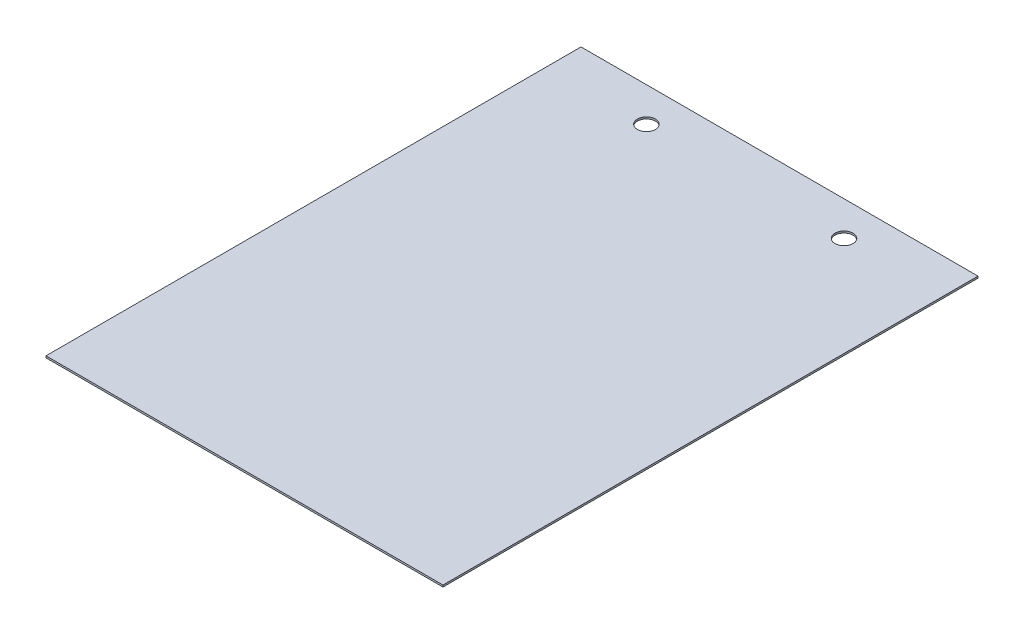
ISO-10303-21;
HEADER;
FILE_DESCRIPTION(('STEP AP214'),'2;1');
FILE_NAME('part.step','',(''),(''),'','','');
FILE_SCHEMA(('AUTOMOTIVE_DESIGN { 1 0 10303 214 1 1 1 1 }'));
ENDSEC;
DATA;
#1=APPLICATION_CONTEXT('core data for automotive mechanical design processes');
#2=APPLICATION_PROTOCOL_DEFINITION('international standard','automotive_design',2000,#1);
#3=PRODUCT_CONTEXT('',#1,'mechanical');
#4=PRODUCT('Part','Part','',(#3));
#5=PRODUCT_RELATED_PRODUCT_CATEGORY('part','',(#4));
#6=PRODUCT_DEFINITION_FORMATION('','',#4);
#7=PRODUCT_DEFINITION_CONTEXT('part definition',#1,'design');
#8=PRODUCT_DEFINITION('design','',#6,#7);
#9=PRODUCT_DEFINITION_SHAPE('','',#8);
#10=(LENGTH_UNIT() NAMED_UNIT(*) SI_UNIT(.MILLI.,.METRE.));
#11=(NAMED_UNIT(*) PLANE_ANGLE_UNIT() SI_UNIT($,.RADIAN.));
#12=(NAMED_UNIT(*) SI_UNIT($,.STERADIAN.) SOLID_ANGLE_UNIT());
#13=UNCERTAINTY_MEASURE_WITH_UNIT(LENGTH_MEASURE(1.E-05),#10,'distance_accuracy_value','');
#14=(GEOMETRIC_REPRESENTATION_CONTEXT(3) GLOBAL_UNCERTAINTY_ASSIGNED_CONTEXT((#13)) GLOBAL_UNIT_ASSIGNED_CONTEXT((#10,
#11,#12)) REPRESENTATION_CONTEXT('',''));
#15=CARTESIAN_POINT('',(0.,0.,0.));
#16=DIRECTION('',(0.,0.,1.));
#17=DIRECTION('',(1.,0.,0.));
#18=AXIS2_PLACEMENT_3D('',#15,#16,#17);
#19=CARTESIAN_POINT('',(-1021.,-928.25,840.45));
#20=DIRECTION('',(0.,-1.,0.));
#21=DIRECTION('',(0.,0.,-1.));
#22=AXIS2_PLACEMENT_3D('',#19,#20,#21);
#23=PLANE('',#22);
#24=DIRECTION('',(1.,0.,0.));
#25=VECTOR('',#24,1.);
#26=CARTESIAN_POINT('',(-1241.,-928.25,840.45));
#27=LINE('',#26,#25);
#28=CARTESIAN_POINT('',(-1241.,-928.25,840.45));
#29=VERTEX_POINT('',#28);
#30=CARTESIAN_POINT('',(-801.,-928.25,840.45));
#31=VERTEX_POINT('',#30);
#32=EDGE_CURVE('E115',#29,#31,#27,.T.);
#33=ORIENTED_EDGE('',*,*,#32,.F.);
#34=DIRECTION('',(0.,0.,-1.));
#35=VECTOR('',#34,1.);
#36=CARTESIAN_POINT('',(-1241.,-928.25,1433.45));
#37=LINE('',#36,#35);
#38=CARTESIAN_POINT('',(-1241.,-928.25,1433.45));
#39=VERTEX_POINT('',#38);
#40=EDGE_CURVE('E36',#39,#29,#37,.T.);
#41=ORIENTED_EDGE('',*,*,#40,.F.);
#42=DIRECTION('',(-1.,0.,0.));
#43=VECTOR('',#42,1.);
#44=CARTESIAN_POINT('',(-801.,-928.25,1433.45));
#45=LINE('',#44,#43);
#46=CARTESIAN_POINT('',(-801.,-928.25,1433.45));
#47=VERTEX_POINT('',#46);
#48=EDGE_CURVE('E183',#47,#39,#45,.T.);
#49=ORIENTED_EDGE('',*,*,#48,.F.);
#50=DIRECTION('',(0.,0.,1.));
#51=VECTOR('',#50,1.);
#52=CARTESIAN_POINT('',(-801.,-928.25,840.45));
#53=LINE('',#52,#51);
#54=EDGE_CURVE('E242',#31,#47,#53,.T.);
#55=ORIENTED_EDGE('',*,*,#54,.F.);
#56=EDGE_LOOP('',(#33,#41,#49,#55));
#57=FACE_BOUND('',#56,.T.);
#58=CARTESIAN_POINT('',(-911.5,-928.25,878.45));
#59=DIRECTION('',(0.,-1.,0.));
#60=DIRECTION('',(-1.,0.,0.));
#61=AXIS2_PLACEMENT_3D('',#58,#59,#60);
#62=CIRCLE('',#61,10.);
#63=CARTESIAN_POINT('',(-921.5,-928.25,878.45));
#64=VERTEX_POINT('',#63);
#65=CARTESIAN_POINT('',(-901.5,-928.25,878.45));
#66=VERTEX_POINT('',#65);
#67=EDGE_CURVE('E11',#64,#66,#62,.T.);
#68=ORIENTED_EDGE('',*,*,#67,.T.);
#69=CARTESIAN_POINT('',(-911.5,-928.25,878.45));
#70=DIRECTION('',(0.,-1.,0.));
#71=DIRECTION('',(1.,0.,0.));
#72=AXIS2_PLACEMENT_3D('',#69,#70,#71);
#73=CIRCLE('',#72,10.);
#74=EDGE_CURVE('E27',#66,#64,#73,.T.);
#75=ORIENTED_EDGE('',*,*,#74,.T.);
#76=EDGE_LOOP('',(#68,#75));
#77=FACE_BOUND('',#76,.T.);
#78=CARTESIAN_POINT('',(-1130.5,-928.25,878.45));
#79=DIRECTION('',(0.,-1.,0.));
#80=DIRECTION('',(-1.,0.,0.));
#81=AXIS2_PLACEMENT_3D('',#78,#79,#80);
#82=CIRCLE('',#81,10.);
#83=CARTESIAN_POINT('',(-1140.5,-928.25,878.45));
#84=VERTEX_POINT('',#83);
#85=CARTESIAN_POINT('',(-1120.5,-928.25,878.45));
#86=VERTEX_POINT('',#85);
#87=EDGE_CURVE('E170',#84,#86,#82,.T.);
#88=ORIENTED_EDGE('',*,*,#87,.T.);
#89=CARTESIAN_POINT('',(-1130.5,-928.25,878.45));
#90=DIRECTION('',(0.,-1.,0.));
#91=DIRECTION('',(1.,0.,0.));
#92=AXIS2_PLACEMENT_3D('',#89,#90,#91);
#93=CIRCLE('',#92,10.);
#94=EDGE_CURVE('E173',#86,#84,#93,.T.);
#95=ORIENTED_EDGE('',*,*,#94,.T.);
#96=EDGE_LOOP('',(#88,#95));
#97=FACE_BOUND('',#96,.T.);
#98=ADVANCED_FACE('F17',(#57,#77,#97),#23,.F.);
#99=CARTESIAN_POINT('',(-801.,-928.25,840.45));
#100=DIRECTION('',(1.,0.,0.));
#101=DIRECTION('',(0.,1.,0.));
#102=AXIS2_PLACEMENT_3D('',#99,#100,#101);
#103=PLANE('',#102);
#104=ORIENTED_EDGE('',*,*,#54,.T.);
#105=DIRECTION('',(0.,1.,0.));
#106=VECTOR('',#105,1.);
#107=CARTESIAN_POINT('',(-801.,-930.27,1433.45));
#108=LINE('',#107,#106);
#109=CARTESIAN_POINT('',(-801.,-930.27,1433.45));
#110=VERTEX_POINT('',#109);
#111=EDGE_CURVE('E189',#110,#47,#108,.T.);
#112=ORIENTED_EDGE('',*,*,#111,.F.);
#113=DIRECTION('',(0.,0.,-1.));
#114=VECTOR('',#113,1.);
#115=CARTESIAN_POINT('',(-801.,-930.27,1433.45));
#116=LINE('',#115,#114);
#117=CARTESIAN_POINT('',(-801.,-930.27,840.45));
#118=VERTEX_POINT('',#117);
#119=EDGE_CURVE('E245',#110,#118,#116,.T.);
#120=ORIENTED_EDGE('',*,*,#119,.T.);
#121=DIRECTION('',(0.,-1.,0.));
#122=VECTOR('',#121,1.);
#123=CARTESIAN_POINT('',(-801.,-928.25,840.45));
#124=LINE('',#123,#122);
#125=EDGE_CURVE('E251',#31,#118,#124,.T.);
#126=ORIENTED_EDGE('',*,*,#125,.F.);
#127=EDGE_LOOP('',(#104,#112,#120,#126));
#128=FACE_BOUND('',#127,.T.);
#129=ADVANCED_FACE('F282',(#128),#103,.T.);
#130=CARTESIAN_POINT('',(-1241.,-928.25,840.45));
#131=DIRECTION('',(0.,0.,-1.));
#132=DIRECTION('',(0.,-1.,0.));
#133=AXIS2_PLACEMENT_3D('',#130,#131,#132);
#134=PLANE('',#133);
#135=ORIENTED_EDGE('',*,*,#32,.T.);
#136=ORIENTED_EDGE('',*,*,#125,.T.);
#137=DIRECTION('',(-1.,0.,0.));
#138=VECTOR('',#137,1.);
#139=CARTESIAN_POINT('',(-801.,-930.27,840.45));
#140=LINE('',#139,#138);
#141=CARTESIAN_POINT('',(-1241.,-930.27,840.45));
#142=VERTEX_POINT('',#141);
#143=EDGE_CURVE('E218',#118,#142,#140,.T.);
#144=ORIENTED_EDGE('',*,*,#143,.T.);
#145=DIRECTION('',(0.,1.,0.));
#146=VECTOR('',#145,1.);
#147=CARTESIAN_POINT('',(-1241.,-930.27,840.45));
#148=LINE('',#147,#146);
#149=EDGE_CURVE('E216',#142,#29,#148,.T.);
#150=ORIENTED_EDGE('',*,*,#149,.T.);
#151=EDGE_LOOP('',(#135,#136,#144,#150));
#152=FACE_BOUND('',#151,.T.);
#153=ADVANCED_FACE('F273',(#152),#134,.T.);
#154=CARTESIAN_POINT('',(-1241.,-928.25,1433.45));
#155=DIRECTION('',(-1.,0.,0.));
#156=DIRECTION('',(0.,0.,1.));
#157=AXIS2_PLACEMENT_3D('',#154,#155,#156);
#158=PLANE('',#157);
#159=ORIENTED_EDGE('',*,*,#40,.T.);
#160=ORIENTED_EDGE('',*,*,#149,.F.);
#161=DIRECTION('',(0.,0.,1.));
#162=VECTOR('',#161,1.);
#163=CARTESIAN_POINT('',(-1241.,-930.27,840.45));
#164=LINE('',#163,#162);
#165=CARTESIAN_POINT('',(-1241.,-930.27,1433.45));
#166=VERTEX_POINT('',#165);
#167=EDGE_CURVE('E207',#142,#166,#164,.T.);
#168=ORIENTED_EDGE('',*,*,#167,.T.);
#169=DIRECTION('',(0.,1.,0.));
#170=VECTOR('',#169,1.);
#171=CARTESIAN_POINT('',(-1241.,-930.27,1433.45));
#172=LINE('',#171,#170);
#173=EDGE_CURVE('E185',#166,#39,#172,.T.);
#174=ORIENTED_EDGE('',*,*,#173,.T.);
#175=EDGE_LOOP('',(#159,#160,#168,#174));
#176=FACE_BOUND('',#175,.T.);
#177=ADVANCED_FACE('F19',(#176),#158,.T.);
#178=CARTESIAN_POINT('',(-801.,-928.25,1433.45));
#179=DIRECTION('',(0.,0.,1.));
#180=DIRECTION('',(-1.,0.,0.));
#181=AXIS2_PLACEMENT_3D('',#178,#179,#180);
#182=PLANE('',#181);
#183=ORIENTED_EDGE('',*,*,#48,.T.);
#184=ORIENTED_EDGE('',*,*,#173,.F.);
#185=DIRECTION('',(1.,0.,0.));
#186=VECTOR('',#185,1.);
#187=CARTESIAN_POINT('',(-1241.,-930.27,1433.45));
#188=LINE('',#187,#186);
#189=EDGE_CURVE('E186',#166,#110,#188,.T.);
#190=ORIENTED_EDGE('',*,*,#189,.T.);
#191=ORIENTED_EDGE('',*,*,#111,.T.);
#192=EDGE_LOOP('',(#183,#184,#190,#191));
#193=FACE_BOUND('',#192,.T.);
#194=ADVANCED_FACE('F279',(#193),#182,.T.);
#195=CARTESIAN_POINT('',(-1021.,-930.27,840.45));
#196=DIRECTION('',(0.,1.,0.));
#197=DIRECTION('',(-1.,0.,0.));
#198=AXIS2_PLACEMENT_3D('',#195,#196,#197);
#199=PLANE('',#198);
#200=ORIENTED_EDGE('',*,*,#119,.F.);
#201=ORIENTED_EDGE('',*,*,#189,.F.);
#202=ORIENTED_EDGE('',*,*,#167,.F.);
#203=ORIENTED_EDGE('',*,*,#143,.F.);
#204=EDGE_LOOP('',(#200,#201,#202,#203));
#205=FACE_BOUND('',#204,.T.);
#206=CARTESIAN_POINT('',(-876.,-930.27,1378.45));
#207=DIRECTION('',(0.,-1.,0.));
#208=DIRECTION('',(1.,0.,0.));
#209=AXIS2_PLACEMENT_3D('',#206,#207,#208);
#210=CIRCLE('',#209,25.);
#211=CARTESIAN_POINT('',(-851.,-930.27,1378.45));
#212=VERTEX_POINT('',#211);
#213=CARTESIAN_POINT('',(-876.,-930.27,1403.45));
#214=VERTEX_POINT('',#213);
#215=EDGE_CURVE('E149',#212,#214,#210,.T.);
#216=ORIENTED_EDGE('',*,*,#215,.F.);
#217=DIRECTION('',(0.,0.,-1.));
#218=VECTOR('',#217,1.);
#219=CARTESIAN_POINT('',(-851.,-930.27,1378.45));
#220=LINE('',#219,#218);
#221=CARTESIAN_POINT('',(-851.,-930.27,943.45));
#222=VERTEX_POINT('',#221);
#223=EDGE_CURVE('E187',#212,#222,#220,.T.);
#224=ORIENTED_EDGE('',*,*,#223,.T.);
#225=CARTESIAN_POINT('',(-876.,-930.27,943.45));
#226=DIRECTION('',(0.,-1.,0.));
#227=DIRECTION('',(0.,0.,-1.));
#228=AXIS2_PLACEMENT_3D('',#225,#226,#227);
#229=CIRCLE('',#228,25.);
#230=CARTESIAN_POINT('',(-876.,-930.27,918.45));
#231=VERTEX_POINT('',#230);
#232=EDGE_CURVE('E128',#231,#222,#229,.T.);
#233=ORIENTED_EDGE('',*,*,#232,.F.);
#234=DIRECTION('',(-1.,0.,0.));
#235=VECTOR('',#234,1.);
#236=CARTESIAN_POINT('',(-876.,-930.27,918.45));
#237=LINE('',#236,#235);
#238=CARTESIAN_POINT('',(-1166.,-930.27,918.45));
#239=VERTEX_POINT('',#238);
#240=EDGE_CURVE('E177',#231,#239,#237,.T.);
#241=ORIENTED_EDGE('',*,*,#240,.T.);
#242=CARTESIAN_POINT('',(-1166.,-930.27,943.45));
#243=DIRECTION('',(0.,1.,0.));
#244=DIRECTION('',(0.,0.,-1.));
#245=AXIS2_PLACEMENT_3D('',#242,#243,#244);
#246=CIRCLE('',#245,25.);
#247=CARTESIAN_POINT('',(-1191.,-930.27,943.45));
#248=VERTEX_POINT('',#247);
#249=EDGE_CURVE('E223',#239,#248,#246,.T.);
#250=ORIENTED_EDGE('',*,*,#249,.T.);
#251=DIRECTION('',(0.,0.,1.));
#252=VECTOR('',#251,1.);
#253=CARTESIAN_POINT('',(-1191.,-930.27,943.45));
#254=LINE('',#253,#252);
#255=CARTESIAN_POINT('',(-1191.,-930.27,1378.45));
#256=VERTEX_POINT('',#255);
#257=EDGE_CURVE('E226',#248,#256,#254,.T.);
#258=ORIENTED_EDGE('',*,*,#257,.T.);
#259=CARTESIAN_POINT('',(-1166.,-930.27,1378.45));
#260=DIRECTION('',(0.,1.,0.));
#261=DIRECTION('',(-1.,0.,0.));
#262=AXIS2_PLACEMENT_3D('',#259,#260,#261);
#263=CIRCLE('',#262,25.);
#264=CARTESIAN_POINT('',(-1166.,-930.27,1403.45));
#265=VERTEX_POINT('',#264);
#266=EDGE_CURVE('E227',#256,#265,#263,.T.);
#267=ORIENTED_EDGE('',*,*,#266,.T.);
#268=DIRECTION('',(1.,0.,0.));
#269=VECTOR('',#268,1.);
#270=CARTESIAN_POINT('',(-1166.,-930.27,1403.45));
#271=LINE('',#270,#269);
#272=EDGE_CURVE('E229',#265,#214,#271,.T.);
#273=ORIENTED_EDGE('',*,*,#272,.T.);
#274=EDGE_LOOP('',(#216,#224,#233,#241,#250,#258,#267,#273));
#275=FACE_BOUND('',#274,.T.);
#276=CARTESIAN_POINT('',(-911.5,-930.27,878.45));
#277=DIRECTION('',(0.,-1.,0.));
#278=DIRECTION('',(-1.,0.,0.));
#279=AXIS2_PLACEMENT_3D('',#276,#277,#278);
#280=CIRCLE('',#279,10.);
#281=CARTESIAN_POINT('',(-921.5,-930.27,878.45));
#282=VERTEX_POINT('',#281);
#283=CARTESIAN_POINT('',(-901.5,-930.27,878.45));
#284=VERTEX_POINT('',#283);
#285=EDGE_CURVE('E154',#282,#284,#280,.T.);
#286=ORIENTED_EDGE('',*,*,#285,.F.);
#287=CARTESIAN_POINT('',(-911.5,-930.27,878.45));
#288=DIRECTION('',(0.,-1.,0.));
#289=DIRECTION('',(1.,0.,0.));
#290=AXIS2_PLACEMENT_3D('',#287,#288,#289);
#291=CIRCLE('',#290,10.);
#292=EDGE_CURVE('E158',#284,#282,#291,.T.);
#293=ORIENTED_EDGE('',*,*,#292,.F.);
#294=EDGE_LOOP('',(#286,#293));
#295=FACE_BOUND('',#294,.T.);
#296=CARTESIAN_POINT('',(-1130.5,-930.27,878.45));
#297=DIRECTION('',(0.,-1.,0.));
#298=DIRECTION('',(-1.,0.,0.));
#299=AXIS2_PLACEMENT_3D('',#296,#297,#298);
#300=CIRCLE('',#299,10.);
#301=CARTESIAN_POINT('',(-1140.5,-930.27,878.45));
#302=VERTEX_POINT('',#301);
#303=CARTESIAN_POINT('',(-1120.5,-930.27,878.45));
#304=VERTEX_POINT('',#303);
#305=EDGE_CURVE('E215',#302,#304,#300,.T.);
#306=ORIENTED_EDGE('',*,*,#305,.F.);
#307=CARTESIAN_POINT('',(-1130.5,-930.27,878.45));
#308=DIRECTION('',(0.,-1.,0.));
#309=DIRECTION('',(1.,0.,0.));
#310=AXIS2_PLACEMENT_3D('',#307,#308,#309);
#311=CIRCLE('',#310,10.);
#312=EDGE_CURVE('E179',#304,#302,#311,.T.);
#313=ORIENTED_EDGE('',*,*,#312,.F.);
#314=EDGE_LOOP('',(#306,#313));
#315=FACE_BOUND('',#314,.T.);
#316=ADVANCED_FACE('F156',(#205,#275,#295,#315),#199,.F.);
#317=CARTESIAN_POINT('',(-876.,-930.25,1403.45));
#318=DIRECTION('',(0.,0.,-1.));
#319=DIRECTION('',(0.,-1.,0.));
#320=AXIS2_PLACEMENT_3D('',#317,#318,#319);
#321=PLANE('',#320);
#322=DIRECTION('',(-1.,0.,0.));
#323=VECTOR('',#322,1.);
#324=CARTESIAN_POINT('',(-876.,-930.25,1403.45));
#325=LINE('',#324,#323);
#326=CARTESIAN_POINT('',(-876.,-930.25,1403.45));
#327=VERTEX_POINT('',#326);
#328=CARTESIAN_POINT('',(-1166.,-930.25,1403.45));
#329=VERTEX_POINT('',#328);
#330=EDGE_CURVE('E200',#327,#329,#325,.T.);
#331=ORIENTED_EDGE('',*,*,#330,.F.);
#332=DIRECTION('',(0.,-1.,0.));
#333=VECTOR('',#332,1.);
#334=CARTESIAN_POINT('',(-876.,-930.25,1403.45));
#335=LINE('',#334,#333);
#336=EDGE_CURVE('E233',#327,#214,#335,.T.);
#337=ORIENTED_EDGE('',*,*,#336,.T.);
#338=ORIENTED_EDGE('',*,*,#272,.F.);
#339=DIRECTION('',(0.,1.,0.));
#340=VECTOR('',#339,1.);
#341=CARTESIAN_POINT('',(-1166.,-930.27,1403.45));
#342=LINE('',#341,#340);
#343=EDGE_CURVE('E236',#265,#329,#342,.T.);
#344=ORIENTED_EDGE('',*,*,#343,.T.);
#345=EDGE_LOOP('',(#331,#337,#338,#344));
#346=FACE_BOUND('',#345,.T.);
#347=ADVANCED_FACE('F309',(#346),#321,.T.);
#348=CARTESIAN_POINT('',(-1166.,-930.25,1378.45));
#349=DIRECTION('',(0.,1.,0.));
#350=DIRECTION('',(-1.,0.,0.));
#351=AXIS2_PLACEMENT_3D('',#348,#349,#350);
#352=CYLINDRICAL_SURFACE('',#351,25.);
#353=ORIENTED_EDGE('',*,*,#266,.F.);
#354=DIRECTION('',(0.,1.,0.));
#355=VECTOR('',#354,1.);
#356=CARTESIAN_POINT('',(-1191.,-930.27,1378.45));
#357=LINE('',#356,#355);
#358=CARTESIAN_POINT('',(-1191.,-930.25,1378.45));
#359=VERTEX_POINT('',#358);
#360=EDGE_CURVE('E206',#256,#359,#357,.T.);
#361=ORIENTED_EDGE('',*,*,#360,.T.);
#362=CARTESIAN_POINT('',(-1166.,-930.25,1378.45));
#363=DIRECTION('',(0.,1.,0.));
#364=DIRECTION('',(-1.,0.,0.));
#365=AXIS2_PLACEMENT_3D('',#362,#363,#364);
#366=CIRCLE('',#365,25.);
#367=EDGE_CURVE('E203',#359,#329,#366,.T.);
#368=ORIENTED_EDGE('',*,*,#367,.T.);
#369=ORIENTED_EDGE('',*,*,#343,.F.);
#370=EDGE_LOOP('',(#353,#361,#368,#369));
#371=FACE_BOUND('',#370,.T.);
#372=ADVANCED_FACE('F303',(#371),#352,.F.);
#373=CARTESIAN_POINT('',(-1021.,-930.25,840.45));
#374=DIRECTION('',(0.,-1.,0.));
#375=DIRECTION('',(0.,0.,-1.));
#376=AXIS2_PLACEMENT_3D('',#373,#374,#375);
#377=PLANE('',#376);
#378=ORIENTED_EDGE('',*,*,#367,.F.);
#379=DIRECTION('',(0.,0.,-1.));
#380=VECTOR('',#379,1.);
#381=CARTESIAN_POINT('',(-1191.,-930.25,1378.45));
#382=LINE('',#381,#380);
#383=CARTESIAN_POINT('',(-1191.,-930.25,943.45));
#384=VERTEX_POINT('',#383);
#385=EDGE_CURVE('E192',#359,#384,#382,.T.);
#386=ORIENTED_EDGE('',*,*,#385,.T.);
#387=CARTESIAN_POINT('',(-1166.,-930.25,943.45));
#388=DIRECTION('',(0.,1.,0.));
#389=DIRECTION('',(0.,0.,-1.));
#390=AXIS2_PLACEMENT_3D('',#387,#388,#389);
#391=CIRCLE('',#390,25.);
#392=CARTESIAN_POINT('',(-1166.,-930.25,918.45));
#393=VERTEX_POINT('',#392);
#394=EDGE_CURVE('E68',#393,#384,#391,.T.);
#395=ORIENTED_EDGE('',*,*,#394,.F.);
#396=DIRECTION('',(1.,0.,0.));
#397=VECTOR('',#396,1.);
#398=CARTESIAN_POINT('',(-1166.,-930.25,918.45));
#399=LINE('',#398,#397);
#400=CARTESIAN_POINT('',(-876.,-930.25,918.45));
#401=VERTEX_POINT('',#400);
#402=EDGE_CURVE('E190',#393,#401,#399,.T.);
#403=ORIENTED_EDGE('',*,*,#402,.T.);
#404=CARTESIAN_POINT('',(-876.,-930.25,943.45));
#405=DIRECTION('',(0.,1.,0.));
#406=DIRECTION('',(1.,0.,0.));
#407=AXIS2_PLACEMENT_3D('',#404,#405,#406);
#408=CIRCLE('',#407,25.);
#409=CARTESIAN_POINT('',(-851.,-930.25,943.45));
#410=VERTEX_POINT('',#409);
#411=EDGE_CURVE('E199',#410,#401,#408,.T.);
#412=ORIENTED_EDGE('',*,*,#411,.F.);
#413=DIRECTION('',(0.,0.,1.));
#414=VECTOR('',#413,1.);
#415=CARTESIAN_POINT('',(-851.,-930.25,943.45));
#416=LINE('',#415,#414);
#417=CARTESIAN_POINT('',(-851.,-930.25,1378.45));
#418=VERTEX_POINT('',#417);
#419=EDGE_CURVE('E193',#410,#418,#416,.T.);
#420=ORIENTED_EDGE('',*,*,#419,.T.);
#421=CARTESIAN_POINT('',(-876.,-930.25,1378.45));
#422=DIRECTION('',(0.,1.,0.));
#423=DIRECTION('',(0.,0.,1.));
#424=AXIS2_PLACEMENT_3D('',#421,#422,#423);
#425=CIRCLE('',#424,25.);
#426=EDGE_CURVE('E194',#327,#418,#425,.T.);
#427=ORIENTED_EDGE('',*,*,#426,.F.);
#428=ORIENTED_EDGE('',*,*,#330,.T.);
#429=EDGE_LOOP('',(#378,#386,#395,#403,#412,#420,#427,#428));
#430=FACE_BOUND('',#429,.T.);
#431=ADVANCED_FACE('F300',(#430),#377,.T.);
#432=CARTESIAN_POINT('',(-876.,-930.25,1378.45));
#433=DIRECTION('',(0.,1.,0.));
#434=DIRECTION('',(-1.,0.,0.));
#435=AXIS2_PLACEMENT_3D('',#432,#433,#434);
#436=CYLINDRICAL_SURFACE('',#435,25.);
#437=DIRECTION('',(0.,-1.,0.));
#438=VECTOR('',#437,1.);
#439=CARTESIAN_POINT('',(-851.,-930.25,1378.45));
#440=LINE('',#439,#438);
#441=EDGE_CURVE('E202',#418,#212,#440,.T.);
#442=ORIENTED_EDGE('',*,*,#441,.T.);
#443=ORIENTED_EDGE('',*,*,#215,.T.);
#444=ORIENTED_EDGE('',*,*,#336,.F.);
#445=ORIENTED_EDGE('',*,*,#426,.T.);
#446=EDGE_LOOP('',(#442,#443,#444,#445));
#447=FACE_BOUND('',#446,.T.);
#448=ADVANCED_FACE('F302',(#447),#436,.F.);
#449=CARTESIAN_POINT('',(-851.,-930.25,943.45));
#450=DIRECTION('',(-1.,0.,0.));
#451=DIRECTION('',(0.,0.,1.));
#452=AXIS2_PLACEMENT_3D('',#449,#450,#451);
#453=PLANE('',#452);
#454=DIRECTION('',(0.,-1.,0.));
#455=VECTOR('',#454,1.);
#456=CARTESIAN_POINT('',(-851.,-930.25,943.45));
#457=LINE('',#456,#455);
#458=EDGE_CURVE('E196',#410,#222,#457,.T.);
#459=ORIENTED_EDGE('',*,*,#458,.T.);
#460=ORIENTED_EDGE('',*,*,#223,.F.);
#461=ORIENTED_EDGE('',*,*,#441,.F.);
#462=ORIENTED_EDGE('',*,*,#419,.F.);
#463=EDGE_LOOP('',(#459,#460,#461,#462));
#464=FACE_BOUND('',#463,.T.);
#465=ADVANCED_FACE('F299',(#464),#453,.T.);
#466=CARTESIAN_POINT('',(-876.,-930.25,943.45));
#467=DIRECTION('',(0.,1.,0.));
#468=DIRECTION('',(-1.,0.,0.));
#469=AXIS2_PLACEMENT_3D('',#466,#467,#468);
#470=CYLINDRICAL_SURFACE('',#469,25.);
#471=DIRECTION('',(0.,-1.,0.));
#472=VECTOR('',#471,1.);
#473=CARTESIAN_POINT('',(-876.,-930.25,918.45));
#474=LINE('',#473,#472);
#475=EDGE_CURVE('E198',#401,#231,#474,.T.);
#476=ORIENTED_EDGE('',*,*,#475,.T.);
#477=ORIENTED_EDGE('',*,*,#232,.T.);
#478=ORIENTED_EDGE('',*,*,#458,.F.);
#479=ORIENTED_EDGE('',*,*,#411,.T.);
#480=EDGE_LOOP('',(#476,#477,#478,#479));
#481=FACE_BOUND('',#480,.T.);
#482=ADVANCED_FACE('F296',(#481),#470,.F.);
#483=CARTESIAN_POINT('',(-1166.,-930.25,918.45));
#484=DIRECTION('',(0.,0.,1.));
#485=DIRECTION('',(-1.,0.,0.));
#486=AXIS2_PLACEMENT_3D('',#483,#484,#485);
#487=PLANE('',#486);
#488=ORIENTED_EDGE('',*,*,#240,.F.);
#489=ORIENTED_EDGE('',*,*,#475,.F.);
#490=ORIENTED_EDGE('',*,*,#402,.F.);
#491=DIRECTION('',(0.,1.,0.));
#492=VECTOR('',#491,1.);
#493=CARTESIAN_POINT('',(-1166.,-930.27,918.45));
#494=LINE('',#493,#492);
#495=EDGE_CURVE('E211',#239,#393,#494,.T.);
#496=ORIENTED_EDGE('',*,*,#495,.F.);
#497=EDGE_LOOP('',(#488,#489,#490,#496));
#498=FACE_BOUND('',#497,.T.);
#499=ADVANCED_FACE('F298',(#498),#487,.T.);
#500=CARTESIAN_POINT('',(-1166.,-930.25,943.45));
#501=DIRECTION('',(0.,1.,0.));
#502=DIRECTION('',(-1.,0.,0.));
#503=AXIS2_PLACEMENT_3D('',#500,#501,#502);
#504=CYLINDRICAL_SURFACE('',#503,25.);
#505=ORIENTED_EDGE('',*,*,#249,.F.);
#506=ORIENTED_EDGE('',*,*,#495,.T.);
#507=ORIENTED_EDGE('',*,*,#394,.T.);
#508=DIRECTION('',(0.,1.,0.));
#509=VECTOR('',#508,1.);
#510=CARTESIAN_POINT('',(-1191.,-930.27,943.45));
#511=LINE('',#510,#509);
#512=EDGE_CURVE('E239',#248,#384,#511,.T.);
#513=ORIENTED_EDGE('',*,*,#512,.F.);
#514=EDGE_LOOP('',(#505,#506,#507,#513));
#515=FACE_BOUND('',#514,.T.);
#516=ADVANCED_FACE('F318',(#515),#504,.F.);
#517=CARTESIAN_POINT('',(-1191.,-930.25,1378.45));
#518=DIRECTION('',(1.,0.,0.));
#519=DIRECTION('',(0.,1.,0.));
#520=AXIS2_PLACEMENT_3D('',#517,#518,#519);
#521=PLANE('',#520);
#522=ORIENTED_EDGE('',*,*,#257,.F.);
#523=ORIENTED_EDGE('',*,*,#512,.T.);
#524=ORIENTED_EDGE('',*,*,#385,.F.);
#525=ORIENTED_EDGE('',*,*,#360,.F.);
#526=EDGE_LOOP('',(#522,#523,#524,#525));
#527=FACE_BOUND('',#526,.T.);
#528=ADVANCED_FACE('F317',(#527),#521,.T.);
#529=CARTESIAN_POINT('',(-911.5,-928.25,878.45));
#530=DIRECTION('',(0.,-1.,0.));
#531=DIRECTION('',(1.,0.,0.));
#532=AXIS2_PLACEMENT_3D('',#529,#530,#531);
#533=CYLINDRICAL_SURFACE('',#532,10.);
#534=DIRECTION('',(0.,-1.,0.));
#535=VECTOR('',#534,1.);
#536=CARTESIAN_POINT('',(-901.5,-928.25,878.45));
#537=LINE('',#536,#535);
#538=EDGE_CURVE('E165',#66,#284,#537,.T.);
#539=ORIENTED_EDGE('',*,*,#538,.T.);
#540=ORIENTED_EDGE('',*,*,#292,.T.);
#541=DIRECTION('',(0.,-1.,0.));
#542=VECTOR('',#541,1.);
#543=CARTESIAN_POINT('',(-921.5,-928.25,878.45));
#544=LINE('',#543,#542);
#545=EDGE_CURVE('E21',#64,#282,#544,.T.);
#546=ORIENTED_EDGE('',*,*,#545,.F.);
#547=ORIENTED_EDGE('',*,*,#74,.F.);
#548=EDGE_LOOP('',(#539,#540,#546,#547));
#549=FACE_BOUND('',#548,.T.);
#550=ADVANCED_FACE('F164',(#549),#533,.F.);
#551=CARTESIAN_POINT('',(-911.5,-928.25,878.45));
#552=DIRECTION('',(0.,-1.,0.));
#553=DIRECTION('',(1.,0.,0.));
#554=AXIS2_PLACEMENT_3D('',#551,#552,#553);
#555=CYLINDRICAL_SURFACE('',#554,10.);
#556=ORIENTED_EDGE('',*,*,#545,.T.);
#557=ORIENTED_EDGE('',*,*,#285,.T.);
#558=ORIENTED_EDGE('',*,*,#538,.F.);
#559=ORIENTED_EDGE('',*,*,#67,.F.);
#560=EDGE_LOOP('',(#556,#557,#558,#559));
#561=FACE_BOUND('',#560,.T.);
#562=ADVANCED_FACE('F167',(#561),#555,.F.);
#563=CARTESIAN_POINT('',(-1130.5,-928.25,878.45));
#564=DIRECTION('',(0.,-1.,0.));
#565=DIRECTION('',(1.,0.,0.));
#566=AXIS2_PLACEMENT_3D('',#563,#564,#565);
#567=CYLINDRICAL_SURFACE('',#566,10.);
#568=DIRECTION('',(0.,-1.,0.));
#569=VECTOR('',#568,1.);
#570=CARTESIAN_POINT('',(-1120.5,-928.25,878.45));
#571=LINE('',#570,#569);
#572=EDGE_CURVE('E162',#86,#304,#571,.T.);
#573=ORIENTED_EDGE('',*,*,#572,.T.);
#574=ORIENTED_EDGE('',*,*,#312,.T.);
#575=DIRECTION('',(0.,-1.,0.));
#576=VECTOR('',#575,1.);
#577=CARTESIAN_POINT('',(-1140.5,-928.25,878.45));
#578=LINE('',#577,#576);
#579=EDGE_CURVE('E182',#84,#302,#578,.T.);
#580=ORIENTED_EDGE('',*,*,#579,.F.);
#581=ORIENTED_EDGE('',*,*,#94,.F.);
#582=EDGE_LOOP('',(#573,#574,#580,#581));
#583=FACE_BOUND('',#582,.T.);
#584=ADVANCED_FACE('F343',(#583),#567,.F.);
#585=CARTESIAN_POINT('',(-1130.5,-928.25,878.45));
#586=DIRECTION('',(0.,-1.,0.));
#587=DIRECTION('',(1.,0.,0.));
#588=AXIS2_PLACEMENT_3D('',#585,#586,#587);
#589=CYLINDRICAL_SURFACE('',#588,10.);
#590=ORIENTED_EDGE('',*,*,#579,.T.);
#591=ORIENTED_EDGE('',*,*,#305,.T.);
#592=ORIENTED_EDGE('',*,*,#572,.F.);
#593=ORIENTED_EDGE('',*,*,#87,.F.);
#594=EDGE_LOOP('',(#590,#591,#592,#593));
#595=FACE_BOUND('',#594,.T.);
#596=ADVANCED_FACE('F294',(#595),#589,.F.);
#597=CLOSED_SHELL('',(#98,#129,#153,#177,#194,#316,#347,#372,#431,#448,#465,#482,#499,#516,#528,
#550,#562,#584,#596));
#598=MANIFOLD_SOLID_BREP('B1',#597);
#599=ADVANCED_BREP_SHAPE_REPRESENTATION('',(#18,#598),#14);
#600=SHAPE_DEFINITION_REPRESENTATION(#9,#599);
ENDSEC;
END-ISO-10303-21;
